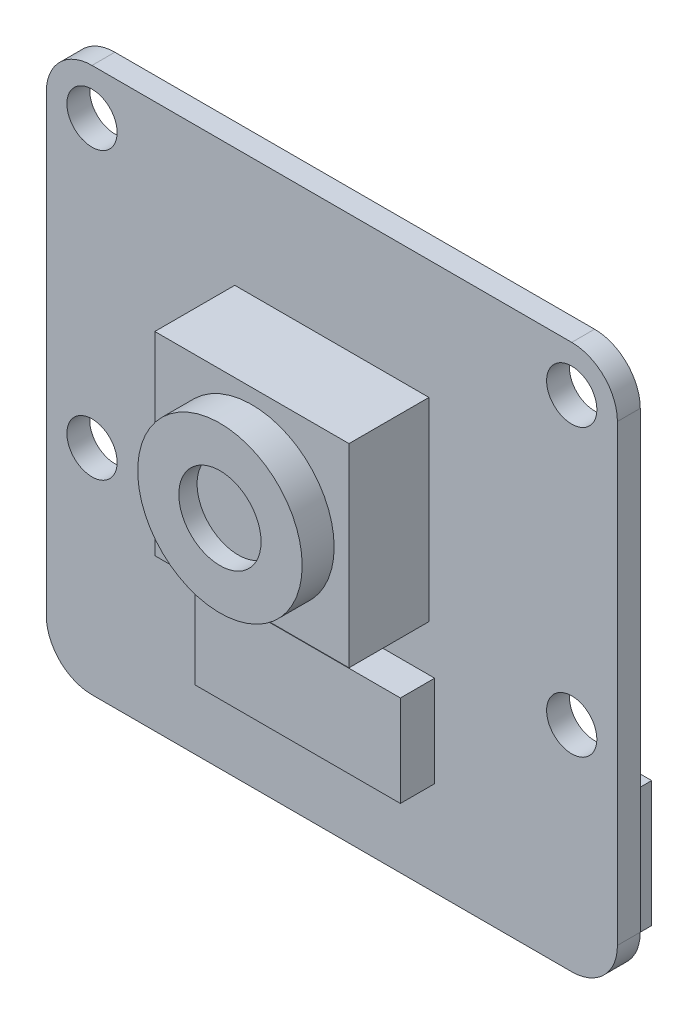
ISO-10303-21;
HEADER;
FILE_DESCRIPTION(('STEP AP214'),'2;1');
FILE_NAME('part.step','',(''),(''),'','','');
FILE_SCHEMA(('AUTOMOTIVE_DESIGN { 1 0 10303 214 1 1 1 1 }'));
ENDSEC;
DATA;
#1=APPLICATION_CONTEXT('core data for automotive mechanical design processes');
#2=APPLICATION_PROTOCOL_DEFINITION('international standard','automotive_design',2000,#1);
#3=PRODUCT_CONTEXT('',#1,'mechanical');
#4=PRODUCT('Part','Part','',(#3));
#5=PRODUCT_RELATED_PRODUCT_CATEGORY('part','',(#4));
#6=PRODUCT_DEFINITION_FORMATION('','',#4);
#7=PRODUCT_DEFINITION_CONTEXT('part definition',#1,'design');
#8=PRODUCT_DEFINITION('design','',#6,#7);
#9=PRODUCT_DEFINITION_SHAPE('','',#8);
#10=(LENGTH_UNIT() NAMED_UNIT(*) SI_UNIT(.MILLI.,.METRE.));
#11=(NAMED_UNIT(*) PLANE_ANGLE_UNIT() SI_UNIT($,.RADIAN.));
#12=(NAMED_UNIT(*) SI_UNIT($,.STERADIAN.) SOLID_ANGLE_UNIT());
#13=UNCERTAINTY_MEASURE_WITH_UNIT(LENGTH_MEASURE(1.E-05),#10,'distance_accuracy_value','');
#14=(GEOMETRIC_REPRESENTATION_CONTEXT(3) GLOBAL_UNCERTAINTY_ASSIGNED_CONTEXT((#13)) GLOBAL_UNIT_ASSIGNED_CONTEXT((#10,
#11,#12)) REPRESENTATION_CONTEXT('',''));
#15=CARTESIAN_POINT('',(0.,0.,0.));
#16=DIRECTION('',(0.,0.,1.));
#17=DIRECTION('',(1.,0.,0.));
#18=AXIS2_PLACEMENT_3D('',#15,#16,#17);
#19=CARTESIAN_POINT('',(0.,0.,1.));
#20=DIRECTION('',(0.,0.,-1.));
#21=DIRECTION('',(-1.,0.,0.));
#22=AXIS2_PLACEMENT_3D('',#19,#20,#21);
#23=PLANE('',#22);
#24=DIRECTION('',(0.,-1.,0.));
#25=VECTOR('',#24,1.);
#26=CARTESIAN_POINT('',(-4.25,-1.781,1.));
#27=LINE('',#26,#25);
#28=CARTESIAN_POINT('',(-4.25,6.719,1.));
#29=VERTEX_POINT('',#28);
#30=CARTESIAN_POINT('',(-4.25,-1.781,1.));
#31=VERTEX_POINT('',#30);
#32=EDGE_CURVE('E286',#29,#31,#27,.T.);
#33=ORIENTED_EDGE('',*,*,#32,.F.);
#34=DIRECTION('',(-1.,0.,0.));
#35=VECTOR('',#34,1.);
#36=CARTESIAN_POINT('',(-4.25,6.719,1.));
#37=LINE('',#36,#35);
#38=CARTESIAN_POINT('',(4.25,6.719,1.));
#39=VERTEX_POINT('',#38);
#40=EDGE_CURVE('E299',#39,#29,#37,.T.);
#41=ORIENTED_EDGE('',*,*,#40,.F.);
#42=DIRECTION('',(0.,1.,0.));
#43=VECTOR('',#42,1.);
#44=CARTESIAN_POINT('',(4.25,-1.781,1.));
#45=LINE('',#44,#43);
#46=CARTESIAN_POINT('',(4.25,-1.781,1.));
#47=VERTEX_POINT('',#46);
#48=EDGE_CURVE('E306',#47,#39,#45,.T.);
#49=ORIENTED_EDGE('',*,*,#48,.F.);
#50=DIRECTION('',(1.,0.,0.));
#51=VECTOR('',#50,1.);
#52=CARTESIAN_POINT('',(-4.25,-1.781,1.));
#53=LINE('',#52,#51);
#54=EDGE_CURVE('E304',#31,#47,#53,.T.);
#55=ORIENTED_EDGE('',*,*,#54,.F.);
#56=EDGE_LOOP('',(#33,#41,#49,#55));
#57=FACE_BOUND('',#56,.T.);
#58=CARTESIAN_POINT('',(-10.5,9.931,1.));
#59=DIRECTION('',(0.,0.,1.));
#60=DIRECTION('',(1.,0.,0.));
#61=AXIS2_PLACEMENT_3D('',#58,#59,#60);
#62=CIRCLE('',#61,1.1);
#63=CARTESIAN_POINT('',(-9.4,9.931,1.));
#64=VERTEX_POINT('',#63);
#65=EDGE_CURVE('E332',#64,#64,#62,.T.);
#66=ORIENTED_EDGE('',*,*,#65,.F.);
#67=EDGE_LOOP('',(#66));
#68=FACE_BOUND('',#67,.T.);
#69=CARTESIAN_POINT('',(10.5,-2.569,1.));
#70=DIRECTION('',(0.,0.,1.));
#71=DIRECTION('',(1.,0.,0.));
#72=AXIS2_PLACEMENT_3D('',#69,#70,#71);
#73=CIRCLE('',#72,1.1);
#74=CARTESIAN_POINT('',(11.6,-2.569,1.));
#75=VERTEX_POINT('',#74);
#76=EDGE_CURVE('E340',#75,#75,#73,.T.);
#77=ORIENTED_EDGE('',*,*,#76,.F.);
#78=EDGE_LOOP('',(#77));
#79=FACE_BOUND('',#78,.T.);
#80=CARTESIAN_POINT('',(-10.5,-2.569,1.));
#81=DIRECTION('',(0.,0.,1.));
#82=DIRECTION('',(1.,0.,0.));
#83=AXIS2_PLACEMENT_3D('',#80,#81,#82);
#84=CIRCLE('',#83,1.1);
#85=CARTESIAN_POINT('',(-9.4,-2.569,1.));
#86=VERTEX_POINT('',#85);
#87=EDGE_CURVE('E324',#86,#86,#84,.T.);
#88=ORIENTED_EDGE('',*,*,#87,.F.);
#89=EDGE_LOOP('',(#88));
#90=FACE_BOUND('',#89,.T.);
#91=CARTESIAN_POINT('',(10.5,9.931,1.));
#92=DIRECTION('',(0.,0.,1.));
#93=DIRECTION('',(1.,0.,0.));
#94=AXIS2_PLACEMENT_3D('',#91,#92,#93);
#95=CIRCLE('',#94,1.1);
#96=CARTESIAN_POINT('',(11.6,9.931,1.));
#97=VERTEX_POINT('',#96);
#98=EDGE_CURVE('E331',#97,#97,#95,.T.);
#99=ORIENTED_EDGE('',*,*,#98,.F.);
#100=EDGE_LOOP('',(#99));
#101=FACE_BOUND('',#100,.T.);
#102=DIRECTION('',(-1.,0.,0.));
#103=VECTOR('',#102,1.);
#104=CARTESIAN_POINT('',(-12.5,11.931,1.));
#105=LINE('',#104,#103);
#106=CARTESIAN_POINT('',(10.5,11.931,1.));
#107=VERTEX_POINT('',#106);
#108=CARTESIAN_POINT('',(-10.5,11.931,1.));
#109=VERTEX_POINT('',#108);
#110=EDGE_CURVE('E357',#107,#109,#105,.T.);
#111=ORIENTED_EDGE('',*,*,#110,.T.);
#112=CARTESIAN_POINT('',(-10.5,9.931,1.));
#113=DIRECTION('',(0.,0.,-1.));
#114=DIRECTION('',(-1.,0.,0.));
#115=AXIS2_PLACEMENT_3D('',#112,#113,#114);
#116=CIRCLE('',#115,2.);
#117=CARTESIAN_POINT('',(-12.5,9.931,1.));
#118=VERTEX_POINT('',#117);
#119=EDGE_CURVE('E395',#109,#118,#116,.F.);
#120=ORIENTED_EDGE('',*,*,#119,.T.);
#121=DIRECTION('',(0.,-1.,0.));
#122=VECTOR('',#121,1.);
#123=CARTESIAN_POINT('',(-12.5,-11.931,1.));
#124=LINE('',#123,#122);
#125=CARTESIAN_POINT('',(-12.5,-9.931,1.));
#126=VERTEX_POINT('',#125);
#127=EDGE_CURVE('E349',#118,#126,#124,.T.);
#128=ORIENTED_EDGE('',*,*,#127,.T.);
#129=CARTESIAN_POINT('',(-10.5,-9.931,1.));
#130=DIRECTION('',(0.,0.,-1.));
#131=DIRECTION('',(-1.,0.,0.));
#132=AXIS2_PLACEMENT_3D('',#129,#130,#131);
#133=CIRCLE('',#132,2.);
#134=CARTESIAN_POINT('',(-10.5,-11.931,1.));
#135=VERTEX_POINT('',#134);
#136=EDGE_CURVE('E390',#126,#135,#133,.F.);
#137=ORIENTED_EDGE('',*,*,#136,.T.);
#138=DIRECTION('',(1.,0.,0.));
#139=VECTOR('',#138,1.);
#140=CARTESIAN_POINT('',(-12.5,-11.931,1.));
#141=LINE('',#140,#139);
#142=CARTESIAN_POINT('',(10.5,-11.931,1.));
#143=VERTEX_POINT('',#142);
#144=EDGE_CURVE('E351',#135,#143,#141,.T.);
#145=ORIENTED_EDGE('',*,*,#144,.T.);
#146=CARTESIAN_POINT('',(10.5,-9.931,1.));
#147=DIRECTION('',(0.,0.,-1.));
#148=DIRECTION('',(-1.,0.,0.));
#149=AXIS2_PLACEMENT_3D('',#146,#147,#148);
#150=CIRCLE('',#149,2.);
#151=CARTESIAN_POINT('',(12.5,-9.931,1.));
#152=VERTEX_POINT('',#151);
#153=EDGE_CURVE('E386',#143,#152,#150,.F.);
#154=ORIENTED_EDGE('',*,*,#153,.T.);
#155=DIRECTION('',(0.,1.,0.));
#156=VECTOR('',#155,1.);
#157=CARTESIAN_POINT('',(12.5,-11.931,1.));
#158=LINE('',#157,#156);
#159=CARTESIAN_POINT('',(12.5,9.931,1.));
#160=VERTEX_POINT('',#159);
#161=EDGE_CURVE('E358',#152,#160,#158,.T.);
#162=ORIENTED_EDGE('',*,*,#161,.T.);
#163=CARTESIAN_POINT('',(10.5,9.931,1.));
#164=DIRECTION('',(0.,0.,-1.));
#165=DIRECTION('',(-1.,0.,0.));
#166=AXIS2_PLACEMENT_3D('',#163,#164,#165);
#167=CIRCLE('',#166,2.);
#168=EDGE_CURVE('E394',#160,#107,#167,.F.);
#169=ORIENTED_EDGE('',*,*,#168,.T.);
#170=EDGE_LOOP('',(#111,#120,#128,#137,#145,#154,#162,#169));
#171=FACE_BOUND('',#170,.T.);
#172=DIRECTION('',(0.,-1.,0.));
#173=VECTOR('',#172,1.);
#174=CARTESIAN_POINT('',(-4.5,-7.8,1.));
#175=LINE('',#174,#173);
#176=CARTESIAN_POINT('',(-4.5,-3.8,1.));
#177=VERTEX_POINT('',#176);
#178=CARTESIAN_POINT('',(-4.5,-7.8,1.));
#179=VERTEX_POINT('',#178);
#180=EDGE_CURVE('E248',#177,#179,#175,.T.);
#181=ORIENTED_EDGE('',*,*,#180,.F.);
#182=DIRECTION('',(-1.,0.,0.));
#183=VECTOR('',#182,1.);
#184=CARTESIAN_POINT('',(-4.5,-3.8,1.));
#185=LINE('',#184,#183);
#186=CARTESIAN_POINT('',(4.5,-3.8,1.));
#187=VERTEX_POINT('',#186);
#188=EDGE_CURVE('E245',#187,#177,#185,.T.);
#189=ORIENTED_EDGE('',*,*,#188,.F.);
#190=DIRECTION('',(0.,1.,0.));
#191=VECTOR('',#190,1.);
#192=CARTESIAN_POINT('',(4.5,-7.8,1.));
#193=LINE('',#192,#191);
#194=CARTESIAN_POINT('',(4.5,-7.8,1.));
#195=VERTEX_POINT('',#194);
#196=EDGE_CURVE('E113',#195,#187,#193,.T.);
#197=ORIENTED_EDGE('',*,*,#196,.F.);
#198=DIRECTION('',(1.,0.,0.));
#199=VECTOR('',#198,1.);
#200=CARTESIAN_POINT('',(-4.5,-7.8,1.));
#201=LINE('',#200,#199);
#202=EDGE_CURVE('E109',#179,#195,#201,.T.);
#203=ORIENTED_EDGE('',*,*,#202,.F.);
#204=EDGE_LOOP('',(#181,#189,#197,#203));
#205=FACE_BOUND('',#204,.T.);
#206=ADVANCED_FACE('F94',(#57,#68,#79,#90,#101,#171,#205),#23,.F.);
#207=CARTESIAN_POINT('',(-12.5,-11.931,1.));
#208=DIRECTION('',(1.,0.,0.));
#209=DIRECTION('',(0.,0.,-1.));
#210=AXIS2_PLACEMENT_3D('',#207,#208,#209);
#211=PLANE('',#210);
#212=ORIENTED_EDGE('',*,*,#127,.F.);
#213=DIRECTION('',(0.,0.,-1.));
#214=VECTOR('',#213,1.);
#215=CARTESIAN_POINT('',(-12.5,9.931,1.));
#216=LINE('',#215,#214);
#217=CARTESIAN_POINT('',(-12.5,9.931,0.));
#218=VERTEX_POINT('',#217);
#219=EDGE_CURVE('E371',#118,#218,#216,.T.);
#220=ORIENTED_EDGE('',*,*,#219,.T.);
#221=DIRECTION('',(0.,-1.,0.));
#222=VECTOR('',#221,1.);
#223=CARTESIAN_POINT('',(-12.5,-11.931,0.));
#224=LINE('',#223,#222);
#225=CARTESIAN_POINT('',(-12.5,-9.931,0.));
#226=VERTEX_POINT('',#225);
#227=EDGE_CURVE('E347',#218,#226,#224,.T.);
#228=ORIENTED_EDGE('',*,*,#227,.T.);
#229=DIRECTION('',(0.,0.,-1.));
#230=VECTOR('',#229,1.);
#231=CARTESIAN_POINT('',(-12.5,-9.931,1.));
#232=LINE('',#231,#230);
#233=EDGE_CURVE('E362',#226,#126,#232,.F.);
#234=ORIENTED_EDGE('',*,*,#233,.T.);
#235=EDGE_LOOP('',(#212,#220,#228,#234));
#236=FACE_BOUND('',#235,.T.);
#237=ADVANCED_FACE('F437',(#236),#211,.F.);
#238=CARTESIAN_POINT('',(-12.5,-11.931,1.));
#239=DIRECTION('',(0.,1.,0.));
#240=DIRECTION('',(0.,0.,1.));
#241=AXIS2_PLACEMENT_3D('',#238,#239,#240);
#242=PLANE('',#241);
#243=DIRECTION('',(0.,0.,-1.));
#244=VECTOR('',#243,1.);
#245=CARTESIAN_POINT('',(-10.5,-11.931,1.));
#246=LINE('',#245,#244);
#247=CARTESIAN_POINT('',(-10.5,-11.931,0.));
#248=VERTEX_POINT('',#247);
#249=EDGE_CURVE('E399',#135,#248,#246,.T.);
#250=ORIENTED_EDGE('',*,*,#249,.T.);
#251=DIRECTION('',(0.,0.,1.));
#252=VECTOR('',#251,1.);
#253=CARTESIAN_POINT('',(-10.5,-11.931,-2.5));
#254=LINE('',#253,#252);
#255=CARTESIAN_POINT('',(-10.5,-11.931,-2.5));
#256=VERTEX_POINT('',#255);
#257=EDGE_CURVE('E277',#256,#248,#254,.T.);
#258=ORIENTED_EDGE('',*,*,#257,.F.);
#259=DIRECTION('',(-1.,0.,0.));
#260=VECTOR('',#259,1.);
#261=CARTESIAN_POINT('',(10.5,-11.931,-2.5));
#262=LINE('',#261,#260);
#263=CARTESIAN_POINT('',(10.5,-11.931,-2.5));
#264=VERTEX_POINT('',#263);
#265=EDGE_CURVE('E259',#264,#256,#262,.T.);
#266=ORIENTED_EDGE('',*,*,#265,.F.);
#267=DIRECTION('',(0.,0.,1.));
#268=VECTOR('',#267,1.);
#269=CARTESIAN_POINT('',(10.5,-11.931,-2.5));
#270=LINE('',#269,#268);
#271=CARTESIAN_POINT('',(10.5,-11.931,0.));
#272=VERTEX_POINT('',#271);
#273=EDGE_CURVE('E276',#264,#272,#270,.T.);
#274=ORIENTED_EDGE('',*,*,#273,.T.);
#275=DIRECTION('',(0.,0.,-1.));
#276=VECTOR('',#275,1.);
#277=CARTESIAN_POINT('',(10.5,-11.931,1.));
#278=LINE('',#277,#276);
#279=EDGE_CURVE('E98',#272,#143,#278,.F.);
#280=ORIENTED_EDGE('',*,*,#279,.T.);
#281=ORIENTED_EDGE('',*,*,#144,.F.);
#282=EDGE_LOOP('',(#250,#258,#266,#274,#280,#281));
#283=FACE_BOUND('',#282,.T.);
#284=ADVANCED_FACE('F409',(#283),#242,.F.);
#285=CARTESIAN_POINT('',(12.5,-11.931,1.));
#286=DIRECTION('',(-1.,0.,0.));
#287=DIRECTION('',(0.,0.,1.));
#288=AXIS2_PLACEMENT_3D('',#285,#286,#287);
#289=PLANE('',#288);
#290=DIRECTION('',(0.,1.,0.));
#291=VECTOR('',#290,1.);
#292=CARTESIAN_POINT('',(12.5,-11.931,0.));
#293=LINE('',#292,#291);
#294=CARTESIAN_POINT('',(12.5,-9.931,0.));
#295=VERTEX_POINT('',#294);
#296=CARTESIAN_POINT('',(12.5,9.931,0.));
#297=VERTEX_POINT('',#296);
#298=EDGE_CURVE('E364',#295,#297,#293,.T.);
#299=ORIENTED_EDGE('',*,*,#298,.T.);
#300=DIRECTION('',(0.,0.,-1.));
#301=VECTOR('',#300,1.);
#302=CARTESIAN_POINT('',(12.5,9.931,1.));
#303=LINE('',#302,#301);
#304=EDGE_CURVE('E398',#297,#160,#303,.F.);
#305=ORIENTED_EDGE('',*,*,#304,.T.);
#306=ORIENTED_EDGE('',*,*,#161,.F.);
#307=DIRECTION('',(0.,0.,-1.));
#308=VECTOR('',#307,1.);
#309=CARTESIAN_POINT('',(12.5,-9.931,1.));
#310=LINE('',#309,#308);
#311=EDGE_CURVE('E392',#152,#295,#310,.T.);
#312=ORIENTED_EDGE('',*,*,#311,.T.);
#313=EDGE_LOOP('',(#299,#305,#306,#312));
#314=FACE_BOUND('',#313,.T.);
#315=ADVANCED_FACE('F417',(#314),#289,.F.);
#316=CARTESIAN_POINT('',(-12.5,11.931,1.));
#317=DIRECTION('',(0.,-1.,0.));
#318=DIRECTION('',(0.,0.,-1.));
#319=AXIS2_PLACEMENT_3D('',#316,#317,#318);
#320=PLANE('',#319);
#321=DIRECTION('',(-1.,0.,0.));
#322=VECTOR('',#321,1.);
#323=CARTESIAN_POINT('',(-12.5,11.931,0.));
#324=LINE('',#323,#322);
#325=CARTESIAN_POINT('',(10.5,11.931,0.));
#326=VERTEX_POINT('',#325);
#327=CARTESIAN_POINT('',(-10.5,11.931,0.));
#328=VERTEX_POINT('',#327);
#329=EDGE_CURVE('E355',#326,#328,#324,.T.);
#330=ORIENTED_EDGE('',*,*,#329,.T.);
#331=DIRECTION('',(0.,0.,-1.));
#332=VECTOR('',#331,1.);
#333=CARTESIAN_POINT('',(-10.5,11.931,1.));
#334=LINE('',#333,#332);
#335=EDGE_CURVE('E384',#328,#109,#334,.F.);
#336=ORIENTED_EDGE('',*,*,#335,.T.);
#337=ORIENTED_EDGE('',*,*,#110,.F.);
#338=DIRECTION('',(0.,0.,-1.));
#339=VECTOR('',#338,1.);
#340=CARTESIAN_POINT('',(10.5,11.931,1.));
#341=LINE('',#340,#339);
#342=EDGE_CURVE('E385',#107,#326,#341,.T.);
#343=ORIENTED_EDGE('',*,*,#342,.T.);
#344=EDGE_LOOP('',(#330,#336,#337,#343));
#345=FACE_BOUND('',#344,.T.);
#346=ADVANCED_FACE('F427',(#345),#320,.F.);
#347=CARTESIAN_POINT('',(0.,0.,0.));
#348=DIRECTION('',(0.,0.,-1.));
#349=DIRECTION('',(-1.,0.,0.));
#350=AXIS2_PLACEMENT_3D('',#347,#348,#349);
#351=PLANE('',#350);
#352=DIRECTION('',(0.,-1.,0.));
#353=VECTOR('',#352,1.);
#354=CARTESIAN_POINT('',(10.5,-11.931,0.));
#355=LINE('',#354,#353);
#356=CARTESIAN_POINT('',(10.5,-6.431,0.));
#357=VERTEX_POINT('',#356);
#358=EDGE_CURVE('E250',#357,#272,#355,.T.);
#359=ORIENTED_EDGE('',*,*,#358,.F.);
#360=DIRECTION('',(1.,0.,0.));
#361=VECTOR('',#360,1.);
#362=CARTESIAN_POINT('',(10.5,-6.431,0.));
#363=LINE('',#362,#361);
#364=CARTESIAN_POINT('',(-10.5,-6.431,0.));
#365=VERTEX_POINT('',#364);
#366=EDGE_CURVE('E257',#365,#357,#363,.T.);
#367=ORIENTED_EDGE('',*,*,#366,.F.);
#368=DIRECTION('',(0.,1.,0.));
#369=VECTOR('',#368,1.);
#370=CARTESIAN_POINT('',(-10.5,-11.931,0.));
#371=LINE('',#370,#369);
#372=EDGE_CURVE('E249',#248,#365,#371,.T.);
#373=ORIENTED_EDGE('',*,*,#372,.F.);
#374=CARTESIAN_POINT('',(-10.5,-9.931,0.));
#375=DIRECTION('',(0.,0.,-1.));
#376=DIRECTION('',(-1.,0.,0.));
#377=AXIS2_PLACEMENT_3D('',#374,#375,#376);
#378=CIRCLE('',#377,2.);
#379=EDGE_CURVE('E372',#248,#226,#378,.T.);
#380=ORIENTED_EDGE('',*,*,#379,.T.);
#381=ORIENTED_EDGE('',*,*,#227,.F.);
#382=CARTESIAN_POINT('',(-10.5,9.931,0.));
#383=DIRECTION('',(0.,0.,-1.));
#384=DIRECTION('',(-1.,0.,0.));
#385=AXIS2_PLACEMENT_3D('',#382,#383,#384);
#386=CIRCLE('',#385,2.);
#387=EDGE_CURVE('E379',#218,#328,#386,.T.);
#388=ORIENTED_EDGE('',*,*,#387,.T.);
#389=ORIENTED_EDGE('',*,*,#329,.F.);
#390=CARTESIAN_POINT('',(10.5,9.931,0.));
#391=DIRECTION('',(0.,0.,-1.));
#392=DIRECTION('',(-1.,0.,0.));
#393=AXIS2_PLACEMENT_3D('',#390,#391,#392);
#394=CIRCLE('',#393,2.);
#395=EDGE_CURVE('E378',#326,#297,#394,.T.);
#396=ORIENTED_EDGE('',*,*,#395,.T.);
#397=ORIENTED_EDGE('',*,*,#298,.F.);
#398=CARTESIAN_POINT('',(10.5,-9.931,0.));
#399=DIRECTION('',(0.,0.,-1.));
#400=DIRECTION('',(-1.,0.,0.));
#401=AXIS2_PLACEMENT_3D('',#398,#399,#400);
#402=CIRCLE('',#401,2.);
#403=EDGE_CURVE('E376',#295,#272,#402,.T.);
#404=ORIENTED_EDGE('',*,*,#403,.T.);
#405=EDGE_LOOP('',(#359,#367,#373,#380,#381,#388,#389,#396,#397,#404));
#406=FACE_BOUND('',#405,.T.);
#407=CARTESIAN_POINT('',(-10.5,9.931,0.));
#408=DIRECTION('',(0.,0.,1.));
#409=DIRECTION('',(1.,0.,0.));
#410=AXIS2_PLACEMENT_3D('',#407,#408,#409);
#411=CIRCLE('',#410,1.1);
#412=CARTESIAN_POINT('',(-9.4,9.931,0.));
#413=VERTEX_POINT('',#412);
#414=EDGE_CURVE('E333',#413,#413,#411,.T.);
#415=ORIENTED_EDGE('',*,*,#414,.T.);
#416=EDGE_LOOP('',(#415));
#417=FACE_BOUND('',#416,.T.);
#418=CARTESIAN_POINT('',(10.5,-2.569,0.));
#419=DIRECTION('',(0.,0.,1.));
#420=DIRECTION('',(1.,0.,0.));
#421=AXIS2_PLACEMENT_3D('',#418,#419,#420);
#422=CIRCLE('',#421,1.1);
#423=CARTESIAN_POINT('',(11.6,-2.569,0.));
#424=VERTEX_POINT('',#423);
#425=EDGE_CURVE('E327',#424,#424,#422,.T.);
#426=ORIENTED_EDGE('',*,*,#425,.T.);
#427=EDGE_LOOP('',(#426));
#428=FACE_BOUND('',#427,.T.);
#429=CARTESIAN_POINT('',(-10.5,-2.569,0.));
#430=DIRECTION('',(0.,0.,1.));
#431=DIRECTION('',(1.,0.,0.));
#432=AXIS2_PLACEMENT_3D('',#429,#430,#431);
#433=CIRCLE('',#432,1.1);
#434=CARTESIAN_POINT('',(-9.4,-2.569,0.));
#435=VERTEX_POINT('',#434);
#436=EDGE_CURVE('E322',#435,#435,#433,.T.);
#437=ORIENTED_EDGE('',*,*,#436,.T.);
#438=EDGE_LOOP('',(#437));
#439=FACE_BOUND('',#438,.T.);
#440=CARTESIAN_POINT('',(10.5,9.931,0.));
#441=DIRECTION('',(0.,0.,1.));
#442=DIRECTION('',(1.,0.,0.));
#443=AXIS2_PLACEMENT_3D('',#440,#441,#442);
#444=CIRCLE('',#443,1.1);
#445=CARTESIAN_POINT('',(11.6,9.931,0.));
#446=VERTEX_POINT('',#445);
#447=EDGE_CURVE('E343',#446,#446,#444,.T.);
#448=ORIENTED_EDGE('',*,*,#447,.T.);
#449=EDGE_LOOP('',(#448));
#450=FACE_BOUND('',#449,.T.);
#451=ADVANCED_FACE('F419',(#406,#417,#428,#439,#450),#351,.T.);
#452=CARTESIAN_POINT('',(-10.5,9.931,1.));
#453=DIRECTION('',(0.,0.,-1.));
#454=DIRECTION('',(-1.,0.,0.));
#455=AXIS2_PLACEMENT_3D('',#452,#453,#454);
#456=CYLINDRICAL_SURFACE('',#455,2.);
#457=ORIENTED_EDGE('',*,*,#119,.F.);
#458=ORIENTED_EDGE('',*,*,#335,.F.);
#459=ORIENTED_EDGE('',*,*,#387,.F.);
#460=ORIENTED_EDGE('',*,*,#219,.F.);
#461=EDGE_LOOP('',(#457,#458,#459,#460));
#462=FACE_BOUND('',#461,.T.);
#463=ADVANCED_FACE('F434',(#462),#456,.T.);
#464=CARTESIAN_POINT('',(10.5,9.931,1.));
#465=DIRECTION('',(0.,0.,-1.));
#466=DIRECTION('',(-1.,0.,0.));
#467=AXIS2_PLACEMENT_3D('',#464,#465,#466);
#468=CYLINDRICAL_SURFACE('',#467,2.);
#469=ORIENTED_EDGE('',*,*,#168,.F.);
#470=ORIENTED_EDGE('',*,*,#304,.F.);
#471=ORIENTED_EDGE('',*,*,#395,.F.);
#472=ORIENTED_EDGE('',*,*,#342,.F.);
#473=EDGE_LOOP('',(#469,#470,#471,#472));
#474=FACE_BOUND('',#473,.T.);
#475=ADVANCED_FACE('F426',(#474),#468,.T.);
#476=CARTESIAN_POINT('',(10.5,-9.931,1.));
#477=DIRECTION('',(0.,0.,-1.));
#478=DIRECTION('',(-1.,0.,0.));
#479=AXIS2_PLACEMENT_3D('',#476,#477,#478);
#480=CYLINDRICAL_SURFACE('',#479,2.);
#481=ORIENTED_EDGE('',*,*,#153,.F.);
#482=ORIENTED_EDGE('',*,*,#279,.F.);
#483=ORIENTED_EDGE('',*,*,#403,.F.);
#484=ORIENTED_EDGE('',*,*,#311,.F.);
#485=EDGE_LOOP('',(#481,#482,#483,#484));
#486=FACE_BOUND('',#485,.T.);
#487=ADVANCED_FACE('F412',(#486),#480,.T.);
#488=CARTESIAN_POINT('',(-10.5,-9.931,1.));
#489=DIRECTION('',(0.,0.,-1.));
#490=DIRECTION('',(-1.,0.,0.));
#491=AXIS2_PLACEMENT_3D('',#488,#489,#490);
#492=CYLINDRICAL_SURFACE('',#491,2.);
#493=ORIENTED_EDGE('',*,*,#136,.F.);
#494=ORIENTED_EDGE('',*,*,#233,.F.);
#495=ORIENTED_EDGE('',*,*,#379,.F.);
#496=ORIENTED_EDGE('',*,*,#249,.F.);
#497=EDGE_LOOP('',(#493,#494,#495,#496));
#498=FACE_BOUND('',#497,.T.);
#499=ADVANCED_FACE('F96',(#498),#492,.T.);
#500=CARTESIAN_POINT('',(10.5,9.931,0.));
#501=DIRECTION('',(0.,0.,1.));
#502=DIRECTION('',(1.,0.,0.));
#503=AXIS2_PLACEMENT_3D('',#500,#501,#502);
#504=CYLINDRICAL_SURFACE('',#503,1.1);
#505=ORIENTED_EDGE('',*,*,#447,.F.);
#506=EDGE_LOOP('',(#505));
#507=FACE_BOUND('',#506,.T.);
#508=ORIENTED_EDGE('',*,*,#98,.T.);
#509=EDGE_LOOP('',(#508));
#510=FACE_BOUND('',#509,.T.);
#511=ADVANCED_FACE('F444',(#507,#510),#504,.F.);
#512=CARTESIAN_POINT('',(-10.5,-2.569,0.));
#513=DIRECTION('',(0.,0.,1.));
#514=DIRECTION('',(1.,0.,0.));
#515=AXIS2_PLACEMENT_3D('',#512,#513,#514);
#516=CYLINDRICAL_SURFACE('',#515,1.1);
#517=ORIENTED_EDGE('',*,*,#436,.F.);
#518=EDGE_LOOP('',(#517));
#519=FACE_BOUND('',#518,.T.);
#520=ORIENTED_EDGE('',*,*,#87,.T.);
#521=EDGE_LOOP('',(#520));
#522=FACE_BOUND('',#521,.T.);
#523=ADVANCED_FACE('F448',(#519,#522),#516,.F.);
#524=CARTESIAN_POINT('',(10.5,-2.569,0.));
#525=DIRECTION('',(0.,0.,1.));
#526=DIRECTION('',(1.,0.,0.));
#527=AXIS2_PLACEMENT_3D('',#524,#525,#526);
#528=CYLINDRICAL_SURFACE('',#527,1.1);
#529=ORIENTED_EDGE('',*,*,#425,.F.);
#530=EDGE_LOOP('',(#529));
#531=FACE_BOUND('',#530,.T.);
#532=ORIENTED_EDGE('',*,*,#76,.T.);
#533=EDGE_LOOP('',(#532));
#534=FACE_BOUND('',#533,.T.);
#535=ADVANCED_FACE('F495',(#531,#534),#528,.F.);
#536=CARTESIAN_POINT('',(-10.5,9.931,0.));
#537=DIRECTION('',(0.,0.,1.));
#538=DIRECTION('',(1.,0.,0.));
#539=AXIS2_PLACEMENT_3D('',#536,#537,#538);
#540=CYLINDRICAL_SURFACE('',#539,1.1);
#541=ORIENTED_EDGE('',*,*,#414,.F.);
#542=EDGE_LOOP('',(#541));
#543=FACE_BOUND('',#542,.T.);
#544=ORIENTED_EDGE('',*,*,#65,.T.);
#545=EDGE_LOOP('',(#544));
#546=FACE_BOUND('',#545,.T.);
#547=ADVANCED_FACE('F504',(#543,#546),#540,.F.);
#548=CARTESIAN_POINT('',(-4.25,-1.781,4.5));
#549=DIRECTION('',(1.,0.,0.));
#550=DIRECTION('',(0.,0.,-1.));
#551=AXIS2_PLACEMENT_3D('',#548,#549,#550);
#552=PLANE('',#551);
#553=ORIENTED_EDGE('',*,*,#32,.T.);
#554=DIRECTION('',(0.,0.,-1.));
#555=VECTOR('',#554,1.);
#556=CARTESIAN_POINT('',(-4.25,-1.781,4.5));
#557=LINE('',#556,#555);
#558=CARTESIAN_POINT('',(-4.25,-1.781,4.5));
#559=VERTEX_POINT('',#558);
#560=EDGE_CURVE('E321',#559,#31,#557,.T.);
#561=ORIENTED_EDGE('',*,*,#560,.F.);
#562=DIRECTION('',(0.,-1.,0.));
#563=VECTOR('',#562,1.);
#564=CARTESIAN_POINT('',(-4.25,-1.781,4.5));
#565=LINE('',#564,#563);
#566=CARTESIAN_POINT('',(-4.25,6.719,4.5));
#567=VERTEX_POINT('',#566);
#568=EDGE_CURVE('E295',#567,#559,#565,.T.);
#569=ORIENTED_EDGE('',*,*,#568,.F.);
#570=DIRECTION('',(0.,0.,-1.));
#571=VECTOR('',#570,1.);
#572=CARTESIAN_POINT('',(-4.25,6.719,4.5));
#573=LINE('',#572,#571);
#574=EDGE_CURVE('E305',#567,#29,#573,.T.);
#575=ORIENTED_EDGE('',*,*,#574,.T.);
#576=EDGE_LOOP('',(#553,#561,#569,#575));
#577=FACE_BOUND('',#576,.T.);
#578=ADVANCED_FACE('F509',(#577),#552,.F.);
#579=CARTESIAN_POINT('',(-4.25,-1.781,4.5));
#580=DIRECTION('',(0.,1.,0.));
#581=DIRECTION('',(0.,0.,1.));
#582=AXIS2_PLACEMENT_3D('',#579,#580,#581);
#583=PLANE('',#582);
#584=ORIENTED_EDGE('',*,*,#54,.T.);
#585=DIRECTION('',(0.,0.,-1.));
#586=VECTOR('',#585,1.);
#587=CARTESIAN_POINT('',(4.25,-1.781,4.5));
#588=LINE('',#587,#586);
#589=CARTESIAN_POINT('',(4.25,-1.781,4.5));
#590=VERTEX_POINT('',#589);
#591=EDGE_CURVE('E318',#590,#47,#588,.T.);
#592=ORIENTED_EDGE('',*,*,#591,.F.);
#593=DIRECTION('',(1.,0.,0.));
#594=VECTOR('',#593,1.);
#595=CARTESIAN_POINT('',(-4.25,-1.781,4.5));
#596=LINE('',#595,#594);
#597=EDGE_CURVE('E293',#559,#590,#596,.T.);
#598=ORIENTED_EDGE('',*,*,#597,.F.);
#599=ORIENTED_EDGE('',*,*,#560,.T.);
#600=EDGE_LOOP('',(#584,#592,#598,#599));
#601=FACE_BOUND('',#600,.T.);
#602=ADVANCED_FACE('F520',(#601),#583,.F.);
#603=CARTESIAN_POINT('',(4.25,-1.781,4.5));
#604=DIRECTION('',(-1.,0.,0.));
#605=DIRECTION('',(0.,0.,1.));
#606=AXIS2_PLACEMENT_3D('',#603,#604,#605);
#607=PLANE('',#606);
#608=ORIENTED_EDGE('',*,*,#48,.T.);
#609=DIRECTION('',(0.,0.,-1.));
#610=VECTOR('',#609,1.);
#611=CARTESIAN_POINT('',(4.25,6.719,4.5));
#612=LINE('',#611,#610);
#613=CARTESIAN_POINT('',(4.25,6.719,4.5));
#614=VERTEX_POINT('',#613);
#615=EDGE_CURVE('E312',#614,#39,#612,.T.);
#616=ORIENTED_EDGE('',*,*,#615,.F.);
#617=DIRECTION('',(0.,1.,0.));
#618=VECTOR('',#617,1.);
#619=CARTESIAN_POINT('',(4.25,-1.781,4.5));
#620=LINE('',#619,#618);
#621=EDGE_CURVE('E300',#590,#614,#620,.T.);
#622=ORIENTED_EDGE('',*,*,#621,.F.);
#623=ORIENTED_EDGE('',*,*,#591,.T.);
#624=EDGE_LOOP('',(#608,#616,#622,#623));
#625=FACE_BOUND('',#624,.T.);
#626=ADVANCED_FACE('F527',(#625),#607,.F.);
#627=CARTESIAN_POINT('',(-4.25,6.719,4.5));
#628=DIRECTION('',(0.,-1.,0.));
#629=DIRECTION('',(0.,0.,-1.));
#630=AXIS2_PLACEMENT_3D('',#627,#628,#629);
#631=PLANE('',#630);
#632=ORIENTED_EDGE('',*,*,#40,.T.);
#633=ORIENTED_EDGE('',*,*,#574,.F.);
#634=DIRECTION('',(-1.,0.,0.));
#635=VECTOR('',#634,1.);
#636=CARTESIAN_POINT('',(-4.25,6.719,4.5));
#637=LINE('',#636,#635);
#638=EDGE_CURVE('E297',#614,#567,#637,.T.);
#639=ORIENTED_EDGE('',*,*,#638,.F.);
#640=ORIENTED_EDGE('',*,*,#615,.T.);
#641=EDGE_LOOP('',(#632,#633,#639,#640));
#642=FACE_BOUND('',#641,.T.);
#643=ADVANCED_FACE('F536',(#642),#631,.F.);
#644=CARTESIAN_POINT('',(0.,0.,4.5));
#645=DIRECTION('',(0.,0.,-1.));
#646=DIRECTION('',(-1.,0.,0.));
#647=AXIS2_PLACEMENT_3D('',#644,#645,#646);
#648=PLANE('',#647);
#649=CARTESIAN_POINT('',(0.,2.469,4.5));
#650=DIRECTION('',(0.,0.,1.));
#651=DIRECTION('',(1.,0.,0.));
#652=AXIS2_PLACEMENT_3D('',#649,#650,#651);
#653=CIRCLE('',#652,3.6);
#654=CARTESIAN_POINT('',(3.6,2.469,4.5));
#655=VERTEX_POINT('',#654);
#656=EDGE_CURVE('E12',#655,#655,#653,.T.);
#657=ORIENTED_EDGE('',*,*,#656,.F.);
#658=EDGE_LOOP('',(#657));
#659=FACE_BOUND('',#658,.T.);
#660=ORIENTED_EDGE('',*,*,#568,.T.);
#661=ORIENTED_EDGE('',*,*,#597,.T.);
#662=ORIENTED_EDGE('',*,*,#621,.T.);
#663=ORIENTED_EDGE('',*,*,#638,.T.);
#664=EDGE_LOOP('',(#660,#661,#662,#663));
#665=FACE_BOUND('',#664,.T.);
#666=ADVANCED_FACE('F544',(#659,#665),#648,.F.);
#667=CARTESIAN_POINT('',(0.,2.469,5.9));
#668=DIRECTION('',(0.,0.,-1.));
#669=DIRECTION('',(-1.,0.,0.));
#670=AXIS2_PLACEMENT_3D('',#667,#668,#669);
#671=CYLINDRICAL_SURFACE('',#670,3.6);
#672=CARTESIAN_POINT('',(0.,2.469,5.9));
#673=DIRECTION('',(0.,0.,1.));
#674=DIRECTION('',(1.,0.,0.));
#675=AXIS2_PLACEMENT_3D('',#672,#673,#674);
#676=CIRCLE('',#675,3.6);
#677=CARTESIAN_POINT('',(3.6,2.469,5.9));
#678=VERTEX_POINT('',#677);
#679=EDGE_CURVE('E287',#678,#678,#676,.T.);
#680=ORIENTED_EDGE('',*,*,#679,.F.);
#681=EDGE_LOOP('',(#680));
#682=FACE_BOUND('',#681,.T.);
#683=ORIENTED_EDGE('',*,*,#656,.T.);
#684=EDGE_LOOP('',(#683));
#685=FACE_BOUND('',#684,.T.);
#686=ADVANCED_FACE('F551',(#682,#685),#671,.T.);
#687=CARTESIAN_POINT('',(0.,2.469,5.9));
#688=DIRECTION('',(0.,0.,1.));
#689=DIRECTION('',(1.,0.,0.));
#690=AXIS2_PLACEMENT_3D('',#687,#688,#689);
#691=PLANE('',#690);
#692=CARTESIAN_POINT('',(0.,2.469,5.9));
#693=DIRECTION('',(0.,0.,1.));
#694=DIRECTION('',(1.,0.,0.));
#695=AXIS2_PLACEMENT_3D('',#692,#693,#694);
#696=CIRCLE('',#695,1.8);
#697=CARTESIAN_POINT('',(1.8,2.469,5.9));
#698=VERTEX_POINT('',#697);
#699=EDGE_CURVE('E281',#698,#698,#696,.T.);
#700=ORIENTED_EDGE('',*,*,#699,.F.);
#701=EDGE_LOOP('',(#700));
#702=FACE_BOUND('',#701,.T.);
#703=ORIENTED_EDGE('',*,*,#679,.T.);
#704=EDGE_LOOP('',(#703));
#705=FACE_BOUND('',#704,.T.);
#706=ADVANCED_FACE('F563',(#702,#705),#691,.T.);
#707=CARTESIAN_POINT('',(0.,2.469,5.1));
#708=DIRECTION('',(0.,0.,1.));
#709=DIRECTION('',(1.,0.,0.));
#710=AXIS2_PLACEMENT_3D('',#707,#708,#709);
#711=CYLINDRICAL_SURFACE('',#710,1.8);
#712=CARTESIAN_POINT('',(0.,2.469,5.1));
#713=DIRECTION('',(0.,0.,1.));
#714=DIRECTION('',(1.,0.,0.));
#715=AXIS2_PLACEMENT_3D('',#712,#713,#714);
#716=CIRCLE('',#715,1.8);
#717=CARTESIAN_POINT('',(1.8,2.469,5.1));
#718=VERTEX_POINT('',#717);
#719=EDGE_CURVE('E285',#718,#718,#716,.T.);
#720=ORIENTED_EDGE('',*,*,#719,.F.);
#721=EDGE_LOOP('',(#720));
#722=FACE_BOUND('',#721,.T.);
#723=ORIENTED_EDGE('',*,*,#699,.T.);
#724=EDGE_LOOP('',(#723));
#725=FACE_BOUND('',#724,.T.);
#726=ADVANCED_FACE('F571',(#722,#725),#711,.F.);
#727=CARTESIAN_POINT('',(0.,2.469,5.1));
#728=DIRECTION('',(0.,0.,1.));
#729=DIRECTION('',(1.,0.,0.));
#730=AXIS2_PLACEMENT_3D('',#727,#728,#729);
#731=PLANE('',#730);
#732=ORIENTED_EDGE('',*,*,#719,.T.);
#733=EDGE_LOOP('',(#732));
#734=FACE_BOUND('',#733,.T.);
#735=ADVANCED_FACE('F583',(#734),#731,.T.);
#736=CARTESIAN_POINT('',(10.5,-11.931,-2.5));
#737=DIRECTION('',(-1.,0.,0.));
#738=DIRECTION('',(0.,0.,1.));
#739=AXIS2_PLACEMENT_3D('',#736,#737,#738);
#740=PLANE('',#739);
#741=ORIENTED_EDGE('',*,*,#358,.T.);
#742=ORIENTED_EDGE('',*,*,#273,.F.);
#743=DIRECTION('',(0.,-1.,0.));
#744=VECTOR('',#743,1.);
#745=CARTESIAN_POINT('',(10.5,-11.931,-2.5));
#746=LINE('',#745,#744);
#747=CARTESIAN_POINT('',(10.5,-6.431,-2.5));
#748=VERTEX_POINT('',#747);
#749=EDGE_CURVE('E258',#748,#264,#746,.T.);
#750=ORIENTED_EDGE('',*,*,#749,.F.);
#751=DIRECTION('',(0.,0.,1.));
#752=VECTOR('',#751,1.);
#753=CARTESIAN_POINT('',(10.5,-6.431,-2.5));
#754=LINE('',#753,#752);
#755=EDGE_CURVE('E264',#748,#357,#754,.T.);
#756=ORIENTED_EDGE('',*,*,#755,.T.);
#757=EDGE_LOOP('',(#741,#742,#750,#756));
#758=FACE_BOUND('',#757,.T.);
#759=ADVANCED_FACE('F589',(#758),#740,.F.);
#760=CARTESIAN_POINT('',(-10.5,-11.931,-2.5));
#761=DIRECTION('',(1.,0.,0.));
#762=DIRECTION('',(0.,0.,-1.));
#763=AXIS2_PLACEMENT_3D('',#760,#761,#762);
#764=PLANE('',#763);
#765=ORIENTED_EDGE('',*,*,#372,.T.);
#766=DIRECTION('',(0.,0.,1.));
#767=VECTOR('',#766,1.);
#768=CARTESIAN_POINT('',(-10.5,-6.431,-2.5));
#769=LINE('',#768,#767);
#770=CARTESIAN_POINT('',(-10.5,-6.431,-2.5));
#771=VERTEX_POINT('',#770);
#772=EDGE_CURVE('E272',#771,#365,#769,.T.);
#773=ORIENTED_EDGE('',*,*,#772,.F.);
#774=DIRECTION('',(0.,1.,0.));
#775=VECTOR('',#774,1.);
#776=CARTESIAN_POINT('',(-10.5,-11.931,-2.5));
#777=LINE('',#776,#775);
#778=EDGE_CURVE('E265',#256,#771,#777,.T.);
#779=ORIENTED_EDGE('',*,*,#778,.F.);
#780=ORIENTED_EDGE('',*,*,#257,.T.);
#781=EDGE_LOOP('',(#765,#773,#779,#780));
#782=FACE_BOUND('',#781,.T.);
#783=ADVANCED_FACE('F635',(#782),#764,.F.);
#784=CARTESIAN_POINT('',(10.5,-6.431,-2.5));
#785=DIRECTION('',(0.,-1.,0.));
#786=DIRECTION('',(0.,0.,-1.));
#787=AXIS2_PLACEMENT_3D('',#784,#785,#786);
#788=PLANE('',#787);
#789=ORIENTED_EDGE('',*,*,#366,.T.);
#790=ORIENTED_EDGE('',*,*,#755,.F.);
#791=DIRECTION('',(1.,0.,0.));
#792=VECTOR('',#791,1.);
#793=CARTESIAN_POINT('',(10.5,-6.431,-2.5));
#794=LINE('',#793,#792);
#795=EDGE_CURVE('E262',#771,#748,#794,.T.);
#796=ORIENTED_EDGE('',*,*,#795,.F.);
#797=ORIENTED_EDGE('',*,*,#772,.T.);
#798=EDGE_LOOP('',(#789,#790,#796,#797));
#799=FACE_BOUND('',#798,.T.);
#800=ADVANCED_FACE('F643',(#799),#788,.F.);
#801=CARTESIAN_POINT('',(0.,0.,-2.5));
#802=DIRECTION('',(0.,0.,1.));
#803=DIRECTION('',(1.,0.,0.));
#804=AXIS2_PLACEMENT_3D('',#801,#802,#803);
#805=PLANE('',#804);
#806=ORIENTED_EDGE('',*,*,#749,.T.);
#807=ORIENTED_EDGE('',*,*,#265,.T.);
#808=ORIENTED_EDGE('',*,*,#778,.T.);
#809=ORIENTED_EDGE('',*,*,#795,.T.);
#810=EDGE_LOOP('',(#806,#807,#808,#809));
#811=FACE_BOUND('',#810,.T.);
#812=ADVANCED_FACE('F649',(#811),#805,.F.);
#813=CARTESIAN_POINT('',(-4.5,-7.8,2.5));
#814=DIRECTION('',(1.,0.,0.));
#815=DIRECTION('',(0.,0.,-1.));
#816=AXIS2_PLACEMENT_3D('',#813,#814,#815);
#817=PLANE('',#816);
#818=ORIENTED_EDGE('',*,*,#180,.T.);
#819=DIRECTION('',(0.,0.,-1.));
#820=VECTOR('',#819,1.);
#821=CARTESIAN_POINT('',(-4.5,-7.8,2.5));
#822=LINE('',#821,#820);
#823=CARTESIAN_POINT('',(-4.5,-7.8,2.5));
#824=VERTEX_POINT('',#823);
#825=EDGE_CURVE('E226',#824,#179,#822,.T.);
#826=ORIENTED_EDGE('',*,*,#825,.F.);
#827=DIRECTION('',(0.,-1.,0.));
#828=VECTOR('',#827,1.);
#829=CARTESIAN_POINT('',(-4.5,-7.8,2.5));
#830=LINE('',#829,#828);
#831=CARTESIAN_POINT('',(-4.5,-3.8,2.5));
#832=VERTEX_POINT('',#831);
#833=EDGE_CURVE('E234',#832,#824,#830,.T.);
#834=ORIENTED_EDGE('',*,*,#833,.F.);
#835=DIRECTION('',(0.,0.,-1.));
#836=VECTOR('',#835,1.);
#837=CARTESIAN_POINT('',(-4.5,-3.8,2.5));
#838=LINE('',#837,#836);
#839=EDGE_CURVE('E709',#832,#177,#838,.T.);
#840=ORIENTED_EDGE('',*,*,#839,.T.);
#841=EDGE_LOOP('',(#818,#826,#834,#840));
#842=FACE_BOUND('',#841,.T.);
#843=ADVANCED_FACE('F242',(#842),#817,.F.);
#844=CARTESIAN_POINT('',(-4.5,-7.8,2.5));
#845=DIRECTION('',(0.,1.,0.));
#846=DIRECTION('',(0.,0.,1.));
#847=AXIS2_PLACEMENT_3D('',#844,#845,#846);
#848=PLANE('',#847);
#849=ORIENTED_EDGE('',*,*,#202,.T.);
#850=DIRECTION('',(0.,0.,-1.));
#851=VECTOR('',#850,1.);
#852=CARTESIAN_POINT('',(4.5,-7.8,2.5));
#853=LINE('',#852,#851);
#854=CARTESIAN_POINT('',(4.5,-7.8,2.5));
#855=VERTEX_POINT('',#854);
#856=EDGE_CURVE('E227',#855,#195,#853,.T.);
#857=ORIENTED_EDGE('',*,*,#856,.F.);
#858=DIRECTION('',(1.,0.,0.));
#859=VECTOR('',#858,1.);
#860=CARTESIAN_POINT('',(-4.5,-7.8,2.5));
#861=LINE('',#860,#859);
#862=EDGE_CURVE('E224',#824,#855,#861,.T.);
#863=ORIENTED_EDGE('',*,*,#862,.F.);
#864=ORIENTED_EDGE('',*,*,#825,.T.);
#865=EDGE_LOOP('',(#849,#857,#863,#864));
#866=FACE_BOUND('',#865,.T.);
#867=ADVANCED_FACE('F223',(#866),#848,.F.);
#868=CARTESIAN_POINT('',(4.5,-7.8,2.5));
#869=DIRECTION('',(-1.,0.,0.));
#870=DIRECTION('',(0.,0.,1.));
#871=AXIS2_PLACEMENT_3D('',#868,#869,#870);
#872=PLANE('',#871);
#873=ORIENTED_EDGE('',*,*,#196,.T.);
#874=DIRECTION('',(0.,0.,-1.));
#875=VECTOR('',#874,1.);
#876=CARTESIAN_POINT('',(4.5,-3.8,2.5));
#877=LINE('',#876,#875);
#878=CARTESIAN_POINT('',(4.5,-3.8,2.5));
#879=VERTEX_POINT('',#878);
#880=EDGE_CURVE('E252',#879,#187,#877,.T.);
#881=ORIENTED_EDGE('',*,*,#880,.F.);
#882=DIRECTION('',(0.,1.,0.));
#883=VECTOR('',#882,1.);
#884=CARTESIAN_POINT('',(4.5,-7.8,2.5));
#885=LINE('',#884,#883);
#886=EDGE_CURVE('E233',#855,#879,#885,.T.);
#887=ORIENTED_EDGE('',*,*,#886,.F.);
#888=ORIENTED_EDGE('',*,*,#856,.T.);
#889=EDGE_LOOP('',(#873,#881,#887,#888));
#890=FACE_BOUND('',#889,.T.);
#891=ADVANCED_FACE('F677',(#890),#872,.F.);
#892=CARTESIAN_POINT('',(-4.5,-3.8,2.5));
#893=DIRECTION('',(0.,-1.,0.));
#894=DIRECTION('',(0.,0.,-1.));
#895=AXIS2_PLACEMENT_3D('',#892,#893,#894);
#896=PLANE('',#895);
#897=ORIENTED_EDGE('',*,*,#188,.T.);
#898=ORIENTED_EDGE('',*,*,#839,.F.);
#899=DIRECTION('',(-1.,0.,0.));
#900=VECTOR('',#899,1.);
#901=CARTESIAN_POINT('',(-4.5,-3.8,2.5));
#902=LINE('',#901,#900);
#903=EDGE_CURVE('E239',#879,#832,#902,.T.);
#904=ORIENTED_EDGE('',*,*,#903,.F.);
#905=ORIENTED_EDGE('',*,*,#880,.T.);
#906=EDGE_LOOP('',(#897,#898,#904,#905));
#907=FACE_BOUND('',#906,.T.);
#908=ADVANCED_FACE('F683',(#907),#896,.F.);
#909=CARTESIAN_POINT('',(0.,0.,2.5));
#910=DIRECTION('',(0.,0.,-1.));
#911=DIRECTION('',(-1.,0.,0.));
#912=AXIS2_PLACEMENT_3D('',#909,#910,#911);
#913=PLANE('',#912);
#914=ORIENTED_EDGE('',*,*,#833,.T.);
#915=ORIENTED_EDGE('',*,*,#862,.T.);
#916=ORIENTED_EDGE('',*,*,#886,.T.);
#917=ORIENTED_EDGE('',*,*,#903,.T.);
#918=EDGE_LOOP('',(#914,#915,#916,#917));
#919=FACE_BOUND('',#918,.T.);
#920=ADVANCED_FACE('F240',(#919),#913,.F.);
#921=CLOSED_SHELL('',(#206,#237,#284,#315,#346,#451,#463,#475,#487,#499,#511,#523,#535,#547,
#578,#602,#626,#643,#666,#686,#706,#726,#735,#759,#783,#800,#812,#843,#867,#891,#908,#920));
#922=MANIFOLD_SOLID_BREP('B2',#921);
#923=ADVANCED_BREP_SHAPE_REPRESENTATION('',(#18,#922),#14);
#924=SHAPE_DEFINITION_REPRESENTATION(#9,#923);
ENDSEC;
END-ISO-10303-21;
